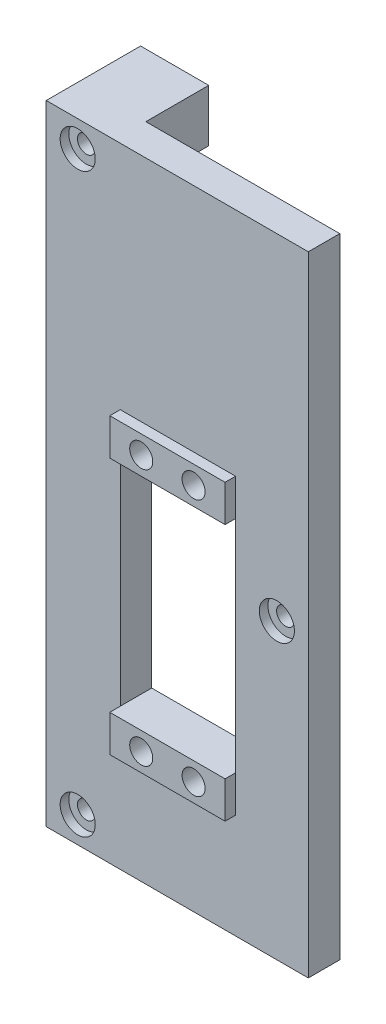
ISO-10303-21;
HEADER;
FILE_DESCRIPTION(('STEP AP214'),'2;1');
FILE_NAME('part.step','',(''),(''),'','','');
FILE_SCHEMA(('AUTOMOTIVE_DESIGN { 1 0 10303 214 1 1 1 1 }'));
ENDSEC;
DATA;
#1=APPLICATION_CONTEXT('core data for automotive mechanical design processes');
#2=APPLICATION_PROTOCOL_DEFINITION('international standard','automotive_design',2000,#1);
#3=PRODUCT_CONTEXT('',#1,'mechanical');
#4=PRODUCT('Part','Part','',(#3));
#5=PRODUCT_RELATED_PRODUCT_CATEGORY('part','',(#4));
#6=PRODUCT_DEFINITION_FORMATION('','',#4);
#7=PRODUCT_DEFINITION_CONTEXT('part definition',#1,'design');
#8=PRODUCT_DEFINITION('design','',#6,#7);
#9=PRODUCT_DEFINITION_SHAPE('','',#8);
#10=(LENGTH_UNIT() NAMED_UNIT(*) SI_UNIT(.MILLI.,.METRE.));
#11=(NAMED_UNIT(*) PLANE_ANGLE_UNIT() SI_UNIT($,.RADIAN.));
#12=(NAMED_UNIT(*) SI_UNIT($,.STERADIAN.) SOLID_ANGLE_UNIT());
#13=UNCERTAINTY_MEASURE_WITH_UNIT(LENGTH_MEASURE(1.E-05),#10,'distance_accuracy_value','');
#14=(GEOMETRIC_REPRESENTATION_CONTEXT(3) GLOBAL_UNCERTAINTY_ASSIGNED_CONTEXT((#13)) GLOBAL_UNIT_ASSIGNED_CONTEXT((#10,
#11,#12)) REPRESENTATION_CONTEXT('',''));
#15=CARTESIAN_POINT('',(0.,0.,0.));
#16=DIRECTION('',(0.,0.,1.));
#17=DIRECTION('',(1.,0.,0.));
#18=AXIS2_PLACEMENT_3D('',#15,#16,#17);
#19=CARTESIAN_POINT('',(-25.,50.,-12.));
#20=DIRECTION('',(0.,1.,0.));
#21=DIRECTION('',(-1.,0.,0.));
#22=AXIS2_PLACEMENT_3D('',#19,#20,#21);
#23=PLANE('',#22);
#24=DIRECTION('',(0.,0.,-1.));
#25=VECTOR('',#24,1.);
#26=CARTESIAN_POINT('',(-12.,50.,0.));
#27=LINE('',#26,#25);
#28=CARTESIAN_POINT('',(-12.,50.,0.));
#29=VERTEX_POINT('',#28);
#30=CARTESIAN_POINT('',(-12.,50.,-12.));
#31=VERTEX_POINT('',#30);
#32=EDGE_CURVE('E311',#29,#31,#27,.T.);
#33=ORIENTED_EDGE('',*,*,#32,.F.);
#34=DIRECTION('',(-1.,0.,0.));
#35=VECTOR('',#34,1.);
#36=CARTESIAN_POINT('',(-25.,50.,0.));
#37=LINE('',#36,#35);
#38=CARTESIAN_POINT('',(-25.,50.,0.));
#39=VERTEX_POINT('',#38);
#40=EDGE_CURVE('E343',#29,#39,#37,.T.);
#41=ORIENTED_EDGE('',*,*,#40,.T.);
#42=DIRECTION('',(0.,0.,1.));
#43=VECTOR('',#42,1.);
#44=CARTESIAN_POINT('',(-25.,50.,-12.));
#45=LINE('',#44,#43);
#46=CARTESIAN_POINT('',(-25.,50.,-12.));
#47=VERTEX_POINT('',#46);
#48=EDGE_CURVE('E347',#47,#39,#45,.T.);
#49=ORIENTED_EDGE('',*,*,#48,.F.);
#50=DIRECTION('',(-1.,0.,0.));
#51=VECTOR('',#50,1.);
#52=CARTESIAN_POINT('',(-25.,50.,-12.));
#53=LINE('',#52,#51);
#54=EDGE_CURVE('E355',#31,#47,#53,.T.);
#55=ORIENTED_EDGE('',*,*,#54,.F.);
#56=EDGE_LOOP('',(#33,#41,#49,#55));
#57=FACE_BOUND('',#56,.T.);
#58=ADVANCED_FACE('F45',(#57),#23,.F.);
#59=CARTESIAN_POINT('',(0.,0.,-12.));
#60=DIRECTION('',(0.,0.,-1.));
#61=DIRECTION('',(-1.,0.,0.));
#62=AXIS2_PLACEMENT_3D('',#59,#60,#61);
#63=PLANE('',#62);
#64=CARTESIAN_POINT('',(-19.,55.,-12.));
#65=DIRECTION('',(0.,0.,-1.));
#66=DIRECTION('',(-1.,0.,0.));
#67=AXIS2_PLACEMENT_3D('',#64,#65,#66);
#68=CIRCLE('',#67,1.7);
#69=CARTESIAN_POINT('',(-20.7,55.,-12.));
#70=VERTEX_POINT('',#69);
#71=EDGE_CURVE('E49',#70,#70,#68,.T.);
#72=ORIENTED_EDGE('',*,*,#71,.F.);
#73=EDGE_LOOP('',(#72));
#74=FACE_BOUND('',#73,.T.);
#75=DIRECTION('',(1.,0.,0.));
#76=VECTOR('',#75,1.);
#77=CARTESIAN_POINT('',(-25.,60.,-12.));
#78=LINE('',#77,#76);
#79=CARTESIAN_POINT('',(-25.,60.,-12.));
#80=VERTEX_POINT('',#79);
#81=CARTESIAN_POINT('',(-12.,60.,-12.));
#82=VERTEX_POINT('',#81);
#83=EDGE_CURVE('E352',#80,#82,#78,.T.);
#84=ORIENTED_EDGE('',*,*,#83,.T.);
#85=DIRECTION('',(0.,1.,0.));
#86=VECTOR('',#85,1.);
#87=CARTESIAN_POINT('',(-12.,50.,-12.));
#88=LINE('',#87,#86);
#89=EDGE_CURVE('E328',#31,#82,#88,.T.);
#90=ORIENTED_EDGE('',*,*,#89,.F.);
#91=ORIENTED_EDGE('',*,*,#54,.T.);
#92=DIRECTION('',(0.,1.,0.));
#93=VECTOR('',#92,1.);
#94=CARTESIAN_POINT('',(-25.,60.,-12.));
#95=LINE('',#94,#93);
#96=EDGE_CURVE('E350',#47,#80,#95,.T.);
#97=ORIENTED_EDGE('',*,*,#96,.T.);
#98=EDGE_LOOP('',(#84,#90,#91,#97));
#99=FACE_BOUND('',#98,.T.);
#100=ADVANCED_FACE('F387',(#74,#99),#63,.T.);
#101=CARTESIAN_POINT('',(0.,0.,0.));
#102=DIRECTION('',(0.,0.,1.));
#103=DIRECTION('',(1.,0.,0.));
#104=AXIS2_PLACEMENT_3D('',#101,#102,#103);
#105=PLANE('',#104);
#106=CARTESIAN_POINT('',(5.12000000000001,-36.53,0.));
#107=DIRECTION('',(0.,0.,1.));
#108=DIRECTION('',(1.,0.,0.));
#109=AXIS2_PLACEMENT_3D('',#106,#107,#108);
#110=CIRCLE('',#109,2.2);
#111=CARTESIAN_POINT('',(7.32000000000001,-36.53,0.));
#112=VERTEX_POINT('',#111);
#113=EDGE_CURVE('E825',#112,#112,#110,.T.);
#114=ORIENTED_EDGE('',*,*,#113,.T.);
#115=EDGE_LOOP('',(#114));
#116=FACE_BOUND('',#115,.T.);
#117=CARTESIAN_POINT('',(-4.87999999999999,12.47,0.));
#118=DIRECTION('',(0.,0.,1.));
#119=DIRECTION('',(1.,0.,0.));
#120=AXIS2_PLACEMENT_3D('',#117,#118,#119);
#121=CIRCLE('',#120,2.2);
#122=CARTESIAN_POINT('',(-2.67999999999999,12.47,0.));
#123=VERTEX_POINT('',#122);
#124=EDGE_CURVE('E826',#123,#123,#121,.T.);
#125=ORIENTED_EDGE('',*,*,#124,.T.);
#126=EDGE_LOOP('',(#125));
#127=FACE_BOUND('',#126,.T.);
#128=CARTESIAN_POINT('',(5.12000000000001,12.47,0.));
#129=DIRECTION('',(0.,0.,1.));
#130=DIRECTION('',(1.,0.,0.));
#131=AXIS2_PLACEMENT_3D('',#128,#129,#130);
#132=CIRCLE('',#131,2.2);
#133=CARTESIAN_POINT('',(7.32000000000001,12.47,0.));
#134=VERTEX_POINT('',#133);
#135=EDGE_CURVE('E831',#134,#134,#132,.T.);
#136=ORIENTED_EDGE('',*,*,#135,.T.);
#137=EDGE_LOOP('',(#136));
#138=FACE_BOUND('',#137,.T.);
#139=CARTESIAN_POINT('',(-4.87999999999999,-36.53,0.));
#140=DIRECTION('',(0.,0.,1.));
#141=DIRECTION('',(1.,0.,0.));
#142=AXIS2_PLACEMENT_3D('',#139,#140,#141);
#143=CIRCLE('',#142,2.2);
#144=CARTESIAN_POINT('',(-2.67999999999999,-36.53,0.));
#145=VERTEX_POINT('',#144);
#146=EDGE_CURVE('E221',#145,#145,#143,.T.);
#147=ORIENTED_EDGE('',*,*,#146,.T.);
#148=EDGE_LOOP('',(#147));
#149=FACE_BOUND('',#148,.T.);
#150=DIRECTION('',(-1.,0.,0.));
#151=VECTOR('',#150,1.);
#152=CARTESIAN_POINT('',(0.,8.97000000000001,0.));
#153=LINE('',#152,#151);
#154=CARTESIAN_POINT('',(11.12,8.97000000000001,0.));
#155=VERTEX_POINT('',#154);
#156=CARTESIAN_POINT('',(-10.88,8.97000000000001,0.));
#157=VERTEX_POINT('',#156);
#158=EDGE_CURVE('E270',#155,#157,#153,.T.);
#159=ORIENTED_EDGE('',*,*,#158,.T.);
#160=DIRECTION('',(0.,-1.,0.));
#161=VECTOR('',#160,1.);
#162=CARTESIAN_POINT('',(-10.88,0.,0.));
#163=LINE('',#162,#161);
#164=CARTESIAN_POINT('',(-10.88,-33.03,0.));
#165=VERTEX_POINT('',#164);
#166=EDGE_CURVE('E273',#157,#165,#163,.T.);
#167=ORIENTED_EDGE('',*,*,#166,.T.);
#168=DIRECTION('',(1.,0.,0.));
#169=VECTOR('',#168,1.);
#170=CARTESIAN_POINT('',(0.,-33.03,0.));
#171=LINE('',#170,#169);
#172=CARTESIAN_POINT('',(11.12,-33.03,0.));
#173=VERTEX_POINT('',#172);
#174=EDGE_CURVE('E257',#165,#173,#171,.T.);
#175=ORIENTED_EDGE('',*,*,#174,.T.);
#176=DIRECTION('',(0.,1.,0.));
#177=VECTOR('',#176,1.);
#178=CARTESIAN_POINT('',(11.12,0.,0.));
#179=LINE('',#178,#177);
#180=EDGE_CURVE('E267',#173,#155,#179,.T.);
#181=ORIENTED_EDGE('',*,*,#180,.T.);
#182=EDGE_LOOP('',(#159,#167,#175,#181));
#183=FACE_BOUND('',#182,.T.);
#184=CARTESIAN_POINT('',(19.,-3.99999999999999,0.));
#185=DIRECTION('',(0.,0.,-1.));
#186=DIRECTION('',(-1.,0.,0.));
#187=AXIS2_PLACEMENT_3D('',#184,#185,#186);
#188=CIRCLE('',#187,1.7);
#189=CARTESIAN_POINT('',(17.3,-3.99999999999999,0.));
#190=VERTEX_POINT('',#189);
#191=EDGE_CURVE('E285',#190,#190,#188,.T.);
#192=ORIENTED_EDGE('',*,*,#191,.F.);
#193=EDGE_LOOP('',(#192));
#194=FACE_BOUND('',#193,.T.);
#195=DIRECTION('',(1.,0.,0.));
#196=VECTOR('',#195,1.);
#197=CARTESIAN_POINT('',(-25.,-50.,0.));
#198=LINE('',#197,#196);
#199=CARTESIAN_POINT('',(-25.,-50.,0.));
#200=VERTEX_POINT('',#199);
#201=CARTESIAN_POINT('',(-12.,-50.,0.));
#202=VERTEX_POINT('',#201);
#203=EDGE_CURVE('E335',#200,#202,#198,.T.);
#204=ORIENTED_EDGE('',*,*,#203,.F.);
#205=DIRECTION('',(0.,-1.,0.));
#206=VECTOR('',#205,1.);
#207=CARTESIAN_POINT('',(-25.,60.,0.));
#208=LINE('',#207,#206);
#209=EDGE_CURVE('E363',#39,#200,#208,.T.);
#210=ORIENTED_EDGE('',*,*,#209,.F.);
#211=ORIENTED_EDGE('',*,*,#40,.F.);
#212=DIRECTION('',(0.,-1.,0.));
#213=VECTOR('',#212,1.);
#214=CARTESIAN_POINT('',(-12.,50.,0.));
#215=LINE('',#214,#213);
#216=CARTESIAN_POINT('',(-12.,60.,0.));
#217=VERTEX_POINT('',#216);
#218=EDGE_CURVE('E324',#217,#29,#215,.T.);
#219=ORIENTED_EDGE('',*,*,#218,.F.);
#220=DIRECTION('',(1.,0.,0.));
#221=VECTOR('',#220,1.);
#222=CARTESIAN_POINT('',(-12.,60.,0.));
#223=LINE('',#222,#221);
#224=CARTESIAN_POINT('',(25.,60.,0.));
#225=VERTEX_POINT('',#224);
#226=EDGE_CURVE('E306',#217,#225,#223,.T.);
#227=ORIENTED_EDGE('',*,*,#226,.T.);
#228=DIRECTION('',(0.,1.,0.));
#229=VECTOR('',#228,1.);
#230=CARTESIAN_POINT('',(25.,60.,0.));
#231=LINE('',#230,#229);
#232=CARTESIAN_POINT('',(25.,-60.,0.));
#233=VERTEX_POINT('',#232);
#234=EDGE_CURVE('E346',#233,#225,#231,.T.);
#235=ORIENTED_EDGE('',*,*,#234,.F.);
#236=DIRECTION('',(1.,0.,0.));
#237=VECTOR('',#236,1.);
#238=CARTESIAN_POINT('',(-12.,-60.,0.));
#239=LINE('',#238,#237);
#240=CARTESIAN_POINT('',(-12.,-60.,0.));
#241=VERTEX_POINT('',#240);
#242=EDGE_CURVE('E318',#241,#233,#239,.T.);
#243=ORIENTED_EDGE('',*,*,#242,.F.);
#244=DIRECTION('',(0.,-1.,0.));
#245=VECTOR('',#244,1.);
#246=CARTESIAN_POINT('',(-12.,-50.,0.));
#247=LINE('',#246,#245);
#248=EDGE_CURVE('E310',#202,#241,#247,.T.);
#249=ORIENTED_EDGE('',*,*,#248,.F.);
#250=EDGE_LOOP('',(#204,#210,#211,#219,#227,#235,#243,#249));
#251=FACE_BOUND('',#250,.T.);
#252=ADVANCED_FACE('F390',(#116,#127,#138,#149,#183,#194,#251),#105,.F.);
#253=CARTESIAN_POINT('',(25.,-60.,6.));
#254=DIRECTION('',(0.,1.,0.));
#255=DIRECTION('',(0.,0.,1.));
#256=AXIS2_PLACEMENT_3D('',#253,#254,#255);
#257=PLANE('',#256);
#258=DIRECTION('',(0.,0.,-1.));
#259=VECTOR('',#258,1.);
#260=CARTESIAN_POINT('',(-12.,-60.,0.));
#261=LINE('',#260,#259);
#262=CARTESIAN_POINT('',(-12.,-60.,-12.));
#263=VERTEX_POINT('',#262);
#264=EDGE_CURVE('E314',#241,#263,#261,.T.);
#265=ORIENTED_EDGE('',*,*,#264,.F.);
#266=ORIENTED_EDGE('',*,*,#242,.T.);
#267=DIRECTION('',(0.,0.,-1.));
#268=VECTOR('',#267,1.);
#269=CARTESIAN_POINT('',(25.,-60.,6.));
#270=LINE('',#269,#268);
#271=CARTESIAN_POINT('',(25.,-60.,6.));
#272=VERTEX_POINT('',#271);
#273=EDGE_CURVE('E11',#272,#233,#270,.T.);
#274=ORIENTED_EDGE('',*,*,#273,.F.);
#275=DIRECTION('',(1.,0.,0.));
#276=VECTOR('',#275,1.);
#277=CARTESIAN_POINT('',(25.,-60.,6.));
#278=LINE('',#277,#276);
#279=CARTESIAN_POINT('',(-25.,-60.,6.));
#280=VERTEX_POINT('',#279);
#281=EDGE_CURVE('E359',#280,#272,#278,.T.);
#282=ORIENTED_EDGE('',*,*,#281,.F.);
#283=DIRECTION('',(0.,0.,-1.));
#284=VECTOR('',#283,1.);
#285=CARTESIAN_POINT('',(-25.,-60.,6.));
#286=LINE('',#285,#284);
#287=CARTESIAN_POINT('',(-25.,-60.,-12.));
#288=VERTEX_POINT('',#287);
#289=EDGE_CURVE('E369',#280,#288,#286,.T.);
#290=ORIENTED_EDGE('',*,*,#289,.T.);
#291=DIRECTION('',(-1.,0.,0.));
#292=VECTOR('',#291,1.);
#293=CARTESIAN_POINT('',(-25.,-60.,-12.));
#294=LINE('',#293,#292);
#295=EDGE_CURVE('E338',#263,#288,#294,.T.);
#296=ORIENTED_EDGE('',*,*,#295,.F.);
#297=EDGE_LOOP('',(#265,#266,#274,#282,#290,#296));
#298=FACE_BOUND('',#297,.T.);
#299=ADVANCED_FACE('F47',(#298),#257,.F.);
#300=CARTESIAN_POINT('',(25.,60.,6.));
#301=DIRECTION('',(-1.,0.,0.));
#302=DIRECTION('',(0.,-1.,0.));
#303=AXIS2_PLACEMENT_3D('',#300,#301,#302);
#304=PLANE('',#303);
#305=ORIENTED_EDGE('',*,*,#273,.T.);
#306=ORIENTED_EDGE('',*,*,#234,.T.);
#307=DIRECTION('',(0.,0.,-1.));
#308=VECTOR('',#307,1.);
#309=CARTESIAN_POINT('',(25.,60.,6.));
#310=LINE('',#309,#308);
#311=CARTESIAN_POINT('',(25.,60.,6.));
#312=VERTEX_POINT('',#311);
#313=EDGE_CURVE('E54',#312,#225,#310,.T.);
#314=ORIENTED_EDGE('',*,*,#313,.F.);
#315=DIRECTION('',(0.,1.,0.));
#316=VECTOR('',#315,1.);
#317=CARTESIAN_POINT('',(25.,60.,6.));
#318=LINE('',#317,#316);
#319=EDGE_CURVE('E362',#272,#312,#318,.T.);
#320=ORIENTED_EDGE('',*,*,#319,.F.);
#321=EDGE_LOOP('',(#305,#306,#314,#320));
#322=FACE_BOUND('',#321,.T.);
#323=ADVANCED_FACE('F422',(#322),#304,.F.);
#324=CARTESIAN_POINT('',(25.,60.,6.));
#325=DIRECTION('',(0.,-1.,0.));
#326=DIRECTION('',(0.,0.,-1.));
#327=AXIS2_PLACEMENT_3D('',#324,#325,#326);
#328=PLANE('',#327);
#329=ORIENTED_EDGE('',*,*,#313,.T.);
#330=ORIENTED_EDGE('',*,*,#226,.F.);
#331=DIRECTION('',(0.,0.,1.));
#332=VECTOR('',#331,1.);
#333=CARTESIAN_POINT('',(-12.,60.,0.));
#334=LINE('',#333,#332);
#335=EDGE_CURVE('E326',#82,#217,#334,.T.);
#336=ORIENTED_EDGE('',*,*,#335,.F.);
#337=ORIENTED_EDGE('',*,*,#83,.F.);
#338=DIRECTION('',(0.,0.,-1.));
#339=VECTOR('',#338,1.);
#340=CARTESIAN_POINT('',(-25.,60.,6.));
#341=LINE('',#340,#339);
#342=CARTESIAN_POINT('',(-25.,60.,6.));
#343=VERTEX_POINT('',#342);
#344=EDGE_CURVE('E375',#343,#80,#341,.T.);
#345=ORIENTED_EDGE('',*,*,#344,.F.);
#346=DIRECTION('',(-1.,0.,0.));
#347=VECTOR('',#346,1.);
#348=CARTESIAN_POINT('',(25.,60.,6.));
#349=LINE('',#348,#347);
#350=EDGE_CURVE('E365',#312,#343,#349,.T.);
#351=ORIENTED_EDGE('',*,*,#350,.F.);
#352=EDGE_LOOP('',(#329,#330,#336,#337,#345,#351));
#353=FACE_BOUND('',#352,.T.);
#354=ADVANCED_FACE('F399',(#353),#328,.F.);
#355=CARTESIAN_POINT('',(-25.,60.,6.));
#356=DIRECTION('',(1.,0.,0.));
#357=DIRECTION('',(0.,1.,0.));
#358=AXIS2_PLACEMENT_3D('',#355,#356,#357);
#359=PLANE('',#358);
#360=ORIENTED_EDGE('',*,*,#344,.T.);
#361=ORIENTED_EDGE('',*,*,#96,.F.);
#362=ORIENTED_EDGE('',*,*,#48,.T.);
#363=ORIENTED_EDGE('',*,*,#209,.T.);
#364=DIRECTION('',(0.,0.,1.));
#365=VECTOR('',#364,1.);
#366=CARTESIAN_POINT('',(-25.,-50.,-12.));
#367=LINE('',#366,#365);
#368=CARTESIAN_POINT('',(-25.,-50.,-12.));
#369=VERTEX_POINT('',#368);
#370=EDGE_CURVE('E340',#369,#200,#367,.T.);
#371=ORIENTED_EDGE('',*,*,#370,.F.);
#372=DIRECTION('',(0.,1.,0.));
#373=VECTOR('',#372,1.);
#374=CARTESIAN_POINT('',(-25.,-60.,-12.));
#375=LINE('',#374,#373);
#376=EDGE_CURVE('E331',#288,#369,#375,.T.);
#377=ORIENTED_EDGE('',*,*,#376,.F.);
#378=ORIENTED_EDGE('',*,*,#289,.F.);
#379=DIRECTION('',(0.,-1.,0.));
#380=VECTOR('',#379,1.);
#381=CARTESIAN_POINT('',(-25.,60.,6.));
#382=LINE('',#381,#380);
#383=EDGE_CURVE('E367',#343,#280,#382,.T.);
#384=ORIENTED_EDGE('',*,*,#383,.F.);
#385=EDGE_LOOP('',(#360,#361,#362,#363,#371,#377,#378,#384));
#386=FACE_BOUND('',#385,.T.);
#387=ADVANCED_FACE('F413',(#386),#359,.F.);
#388=CARTESIAN_POINT('',(0.,0.,6.));
#389=DIRECTION('',(0.,0.,1.));
#390=DIRECTION('',(1.,0.,0.));
#391=AXIS2_PLACEMENT_3D('',#388,#389,#390);
#392=PLANE('',#391);
#393=DIRECTION('',(0.,-1.,0.));
#394=VECTOR('',#393,1.);
#395=CARTESIAN_POINT('',(-10.88,-33.03,6.));
#396=LINE('',#395,#394);
#397=CARTESIAN_POINT('',(-10.88,-33.03,6.));
#398=VERTEX_POINT('',#397);
#399=CARTESIAN_POINT('',(-10.88,-40.03,6.));
#400=VERTEX_POINT('',#399);
#401=EDGE_CURVE('E207',#398,#400,#396,.T.);
#402=ORIENTED_EDGE('',*,*,#401,.F.);
#403=DIRECTION('',(0.,-1.,0.));
#404=VECTOR('',#403,1.);
#405=CARTESIAN_POINT('',(-10.88,8.97000000000001,6.));
#406=LINE('',#405,#404);
#407=CARTESIAN_POINT('',(-10.88,8.97000000000001,6.));
#408=VERTEX_POINT('',#407);
#409=EDGE_CURVE('E208',#408,#398,#406,.T.);
#410=ORIENTED_EDGE('',*,*,#409,.F.);
#411=DIRECTION('',(0.,-1.,0.));
#412=VECTOR('',#411,1.);
#413=CARTESIAN_POINT('',(-10.88,8.97000000000001,6.));
#414=LINE('',#413,#412);
#415=CARTESIAN_POINT('',(-10.88,15.97,6.));
#416=VERTEX_POINT('',#415);
#417=EDGE_CURVE('E69',#416,#408,#414,.T.);
#418=ORIENTED_EDGE('',*,*,#417,.F.);
#419=DIRECTION('',(-1.,0.,0.));
#420=VECTOR('',#419,1.);
#421=CARTESIAN_POINT('',(-10.88,15.97,6.));
#422=LINE('',#421,#420);
#423=CARTESIAN_POINT('',(11.12,15.97,6.));
#424=VERTEX_POINT('',#423);
#425=EDGE_CURVE('E232',#424,#416,#422,.T.);
#426=ORIENTED_EDGE('',*,*,#425,.F.);
#427=DIRECTION('',(0.,1.,0.));
#428=VECTOR('',#427,1.);
#429=CARTESIAN_POINT('',(11.12,8.97000000000001,6.));
#430=LINE('',#429,#428);
#431=CARTESIAN_POINT('',(11.12,8.97000000000001,6.));
#432=VERTEX_POINT('',#431);
#433=EDGE_CURVE('E235',#432,#424,#430,.T.);
#434=ORIENTED_EDGE('',*,*,#433,.F.);
#435=DIRECTION('',(0.,1.,0.));
#436=VECTOR('',#435,1.);
#437=CARTESIAN_POINT('',(11.12,8.97000000000001,6.));
#438=LINE('',#437,#436);
#439=CARTESIAN_POINT('',(11.12,-33.03,6.));
#440=VERTEX_POINT('',#439);
#441=EDGE_CURVE('E211',#440,#432,#438,.T.);
#442=ORIENTED_EDGE('',*,*,#441,.F.);
#443=DIRECTION('',(0.,1.,0.));
#444=VECTOR('',#443,1.);
#445=CARTESIAN_POINT('',(11.12,-33.03,6.));
#446=LINE('',#445,#444);
#447=CARTESIAN_POINT('',(11.12,-40.03,6.));
#448=VERTEX_POINT('',#447);
#449=EDGE_CURVE('E204',#448,#440,#446,.T.);
#450=ORIENTED_EDGE('',*,*,#449,.F.);
#451=DIRECTION('',(1.,0.,0.));
#452=VECTOR('',#451,1.);
#453=CARTESIAN_POINT('',(-10.88,-40.03,6.));
#454=LINE('',#453,#452);
#455=EDGE_CURVE('E62',#400,#448,#454,.T.);
#456=ORIENTED_EDGE('',*,*,#455,.F.);
#457=EDGE_LOOP('',(#402,#410,#418,#426,#434,#442,#450,#456));
#458=FACE_BOUND('',#457,.T.);
#459=CARTESIAN_POINT('',(19.,-3.99999999999999,6.));
#460=DIRECTION('',(0.,0.,1.));
#461=DIRECTION('',(1.,0.,0.));
#462=AXIS2_PLACEMENT_3D('',#459,#460,#461);
#463=CIRCLE('',#462,3.35);
#464=CARTESIAN_POINT('',(22.35,-3.99999999999999,6.));
#465=VERTEX_POINT('',#464);
#466=EDGE_CURVE('E276',#465,#465,#463,.T.);
#467=ORIENTED_EDGE('',*,*,#466,.F.);
#468=EDGE_LOOP('',(#467));
#469=FACE_BOUND('',#468,.T.);
#470=CARTESIAN_POINT('',(-19.,55.,6.));
#471=DIRECTION('',(0.,0.,1.));
#472=DIRECTION('',(1.,0.,0.));
#473=AXIS2_PLACEMENT_3D('',#470,#471,#472);
#474=CIRCLE('',#473,3.35);
#475=CARTESIAN_POINT('',(-15.65,55.,6.));
#476=VERTEX_POINT('',#475);
#477=EDGE_CURVE('E288',#476,#476,#474,.T.);
#478=ORIENTED_EDGE('',*,*,#477,.F.);
#479=EDGE_LOOP('',(#478));
#480=FACE_BOUND('',#479,.T.);
#481=CARTESIAN_POINT('',(-19.,-55.,6.));
#482=DIRECTION('',(0.,0.,1.));
#483=DIRECTION('',(1.,0.,0.));
#484=AXIS2_PLACEMENT_3D('',#481,#482,#483);
#485=CIRCLE('',#484,3.35);
#486=CARTESIAN_POINT('',(-15.65,-55.,6.));
#487=VERTEX_POINT('',#486);
#488=EDGE_CURVE('E297',#487,#487,#485,.T.);
#489=ORIENTED_EDGE('',*,*,#488,.F.);
#490=EDGE_LOOP('',(#489));
#491=FACE_BOUND('',#490,.T.);
#492=ORIENTED_EDGE('',*,*,#281,.T.);
#493=ORIENTED_EDGE('',*,*,#319,.T.);
#494=ORIENTED_EDGE('',*,*,#350,.T.);
#495=ORIENTED_EDGE('',*,*,#383,.T.);
#496=EDGE_LOOP('',(#492,#493,#494,#495));
#497=FACE_BOUND('',#496,.T.);
#498=ADVANCED_FACE('F418',(#458,#469,#480,#491,#497),#392,.T.);
#499=CARTESIAN_POINT('',(-25.,-50.,-12.));
#500=DIRECTION('',(0.,-1.,0.));
#501=DIRECTION('',(0.,0.,-1.));
#502=AXIS2_PLACEMENT_3D('',#499,#500,#501);
#503=PLANE('',#502);
#504=ORIENTED_EDGE('',*,*,#203,.T.);
#505=DIRECTION('',(0.,0.,1.));
#506=VECTOR('',#505,1.);
#507=CARTESIAN_POINT('',(-12.,-50.,0.));
#508=LINE('',#507,#506);
#509=CARTESIAN_POINT('',(-12.,-50.,-12.));
#510=VERTEX_POINT('',#509);
#511=EDGE_CURVE('E307',#510,#202,#508,.T.);
#512=ORIENTED_EDGE('',*,*,#511,.F.);
#513=DIRECTION('',(1.,0.,0.));
#514=VECTOR('',#513,1.);
#515=CARTESIAN_POINT('',(-25.,-50.,-12.));
#516=LINE('',#515,#514);
#517=EDGE_CURVE('E334',#369,#510,#516,.T.);
#518=ORIENTED_EDGE('',*,*,#517,.F.);
#519=ORIENTED_EDGE('',*,*,#370,.T.);
#520=EDGE_LOOP('',(#504,#512,#518,#519));
#521=FACE_BOUND('',#520,.T.);
#522=ADVANCED_FACE('F435',(#521),#503,.F.);
#523=CARTESIAN_POINT('',(0.,0.,-12.));
#524=DIRECTION('',(0.,0.,-1.));
#525=DIRECTION('',(-1.,0.,0.));
#526=AXIS2_PLACEMENT_3D('',#523,#524,#525);
#527=PLANE('',#526);
#528=DIRECTION('',(0.,1.,0.));
#529=VECTOR('',#528,1.);
#530=CARTESIAN_POINT('',(-12.,-50.,-12.));
#531=LINE('',#530,#529);
#532=EDGE_CURVE('E316',#263,#510,#531,.T.);
#533=ORIENTED_EDGE('',*,*,#532,.F.);
#534=ORIENTED_EDGE('',*,*,#295,.T.);
#535=ORIENTED_EDGE('',*,*,#376,.T.);
#536=ORIENTED_EDGE('',*,*,#517,.T.);
#537=EDGE_LOOP('',(#533,#534,#535,#536));
#538=FACE_BOUND('',#537,.T.);
#539=CARTESIAN_POINT('',(-19.,-55.,-12.));
#540=DIRECTION('',(0.,0.,-1.));
#541=DIRECTION('',(-1.,0.,0.));
#542=AXIS2_PLACEMENT_3D('',#539,#540,#541);
#543=CIRCLE('',#542,1.7);
#544=CARTESIAN_POINT('',(-20.7,-55.,-12.));
#545=VERTEX_POINT('',#544);
#546=EDGE_CURVE('E321',#545,#545,#543,.T.);
#547=ORIENTED_EDGE('',*,*,#546,.F.);
#548=EDGE_LOOP('',(#547));
#549=FACE_BOUND('',#548,.T.);
#550=ADVANCED_FACE('F431',(#538,#549),#527,.T.);
#551=CARTESIAN_POINT('',(-19.,-55.,-13.));
#552=DIRECTION('',(0.,0.,1.));
#553=DIRECTION('',(1.,0.,0.));
#554=AXIS2_PLACEMENT_3D('',#551,#552,#553);
#555=CYLINDRICAL_SURFACE('',#554,1.7);
#556=ORIENTED_EDGE('',*,*,#546,.T.);
#557=EDGE_LOOP('',(#556));
#558=FACE_BOUND('',#557,.T.);
#559=CARTESIAN_POINT('',(-19.,-55.,4.35));
#560=DIRECTION('',(0.,0.,1.));
#561=DIRECTION('',(1.,0.,0.));
#562=AXIS2_PLACEMENT_3D('',#559,#560,#561);
#563=CIRCLE('',#562,1.7);
#564=CARTESIAN_POINT('',(-17.3,-55.,4.35));
#565=VERTEX_POINT('',#564);
#566=EDGE_CURVE('E303',#565,#565,#563,.T.);
#567=ORIENTED_EDGE('',*,*,#566,.T.);
#568=EDGE_LOOP('',(#567));
#569=FACE_BOUND('',#568,.T.);
#570=ADVANCED_FACE('F442',(#558,#569),#555,.F.);
#571=CARTESIAN_POINT('',(-19.,55.,-13.));
#572=DIRECTION('',(0.,0.,1.));
#573=DIRECTION('',(1.,0.,0.));
#574=AXIS2_PLACEMENT_3D('',#571,#572,#573);
#575=CYLINDRICAL_SURFACE('',#574,1.7);
#576=ORIENTED_EDGE('',*,*,#71,.T.);
#577=EDGE_LOOP('',(#576));
#578=FACE_BOUND('',#577,.T.);
#579=CARTESIAN_POINT('',(-19.,55.,4.35));
#580=DIRECTION('',(0.,0.,1.));
#581=DIRECTION('',(1.,0.,0.));
#582=AXIS2_PLACEMENT_3D('',#579,#580,#581);
#583=CIRCLE('',#582,1.7);
#584=CARTESIAN_POINT('',(-17.3,55.,4.35));
#585=VERTEX_POINT('',#584);
#586=EDGE_CURVE('E294',#585,#585,#583,.T.);
#587=ORIENTED_EDGE('',*,*,#586,.T.);
#588=EDGE_LOOP('',(#587));
#589=FACE_BOUND('',#588,.T.);
#590=ADVANCED_FACE('F384',(#578,#589),#575,.F.);
#591=CARTESIAN_POINT('',(-12.,0.,0.));
#592=DIRECTION('',(-1.,0.,0.));
#593=DIRECTION('',(0.,0.,1.));
#594=AXIS2_PLACEMENT_3D('',#591,#592,#593);
#595=PLANE('',#594);
#596=ORIENTED_EDGE('',*,*,#511,.T.);
#597=ORIENTED_EDGE('',*,*,#248,.T.);
#598=ORIENTED_EDGE('',*,*,#264,.T.);
#599=ORIENTED_EDGE('',*,*,#532,.T.);
#600=EDGE_LOOP('',(#596,#597,#598,#599));
#601=FACE_BOUND('',#600,.T.);
#602=ADVANCED_FACE('F428',(#601),#595,.F.);
#603=CARTESIAN_POINT('',(-12.,0.,0.));
#604=DIRECTION('',(1.,0.,0.));
#605=DIRECTION('',(0.,0.,-1.));
#606=AXIS2_PLACEMENT_3D('',#603,#604,#605);
#607=PLANE('',#606);
#608=ORIENTED_EDGE('',*,*,#32,.T.);
#609=ORIENTED_EDGE('',*,*,#89,.T.);
#610=ORIENTED_EDGE('',*,*,#335,.T.);
#611=ORIENTED_EDGE('',*,*,#218,.T.);
#612=EDGE_LOOP('',(#608,#609,#610,#611));
#613=FACE_BOUND('',#612,.T.);
#614=ADVANCED_FACE('F405',(#613),#607,.T.);
#615=CARTESIAN_POINT('',(-17.3,-55.,4.35));
#616=DIRECTION('',(0.,0.,-1.));
#617=DIRECTION('',(-1.,0.,0.));
#618=AXIS2_PLACEMENT_3D('',#615,#616,#617);
#619=PLANE('',#618);
#620=ORIENTED_EDGE('',*,*,#566,.F.);
#621=EDGE_LOOP('',(#620));
#622=FACE_BOUND('',#621,.T.);
#623=CARTESIAN_POINT('',(-19.,-55.,4.35));
#624=DIRECTION('',(0.,0.,1.));
#625=DIRECTION('',(1.,0.,0.));
#626=AXIS2_PLACEMENT_3D('',#623,#624,#625);
#627=CIRCLE('',#626,3.35);
#628=CARTESIAN_POINT('',(-15.65,-55.,4.35));
#629=VERTEX_POINT('',#628);
#630=EDGE_CURVE('E300',#629,#629,#627,.T.);
#631=ORIENTED_EDGE('',*,*,#630,.T.);
#632=EDGE_LOOP('',(#631));
#633=FACE_BOUND('',#632,.T.);
#634=ADVANCED_FACE('F495',(#622,#633),#619,.F.);
#635=CARTESIAN_POINT('',(-19.,-55.,6.));
#636=DIRECTION('',(0.,0.,1.));
#637=DIRECTION('',(1.,0.,0.));
#638=AXIS2_PLACEMENT_3D('',#635,#636,#637);
#639=CYLINDRICAL_SURFACE('',#638,3.35);
#640=ORIENTED_EDGE('',*,*,#630,.F.);
#641=EDGE_LOOP('',(#640));
#642=FACE_BOUND('',#641,.T.);
#643=ORIENTED_EDGE('',*,*,#488,.T.);
#644=EDGE_LOOP('',(#643));
#645=FACE_BOUND('',#644,.T.);
#646=ADVANCED_FACE('F503',(#642,#645),#639,.F.);
#647=CARTESIAN_POINT('',(-17.3,55.,4.35));
#648=DIRECTION('',(0.,0.,-1.));
#649=DIRECTION('',(-1.,0.,0.));
#650=AXIS2_PLACEMENT_3D('',#647,#648,#649);
#651=PLANE('',#650);
#652=ORIENTED_EDGE('',*,*,#586,.F.);
#653=EDGE_LOOP('',(#652));
#654=FACE_BOUND('',#653,.T.);
#655=CARTESIAN_POINT('',(-19.,55.,4.35));
#656=DIRECTION('',(0.,0.,1.));
#657=DIRECTION('',(1.,0.,0.));
#658=AXIS2_PLACEMENT_3D('',#655,#656,#657);
#659=CIRCLE('',#658,3.35);
#660=CARTESIAN_POINT('',(-15.65,55.,4.35));
#661=VERTEX_POINT('',#660);
#662=EDGE_CURVE('E291',#661,#661,#659,.T.);
#663=ORIENTED_EDGE('',*,*,#662,.T.);
#664=EDGE_LOOP('',(#663));
#665=FACE_BOUND('',#664,.T.);
#666=ADVANCED_FACE('F512',(#654,#665),#651,.F.);
#667=CARTESIAN_POINT('',(-19.,55.,6.));
#668=DIRECTION('',(0.,0.,1.));
#669=DIRECTION('',(1.,0.,0.));
#670=AXIS2_PLACEMENT_3D('',#667,#668,#669);
#671=CYLINDRICAL_SURFACE('',#670,3.35);
#672=ORIENTED_EDGE('',*,*,#662,.F.);
#673=EDGE_LOOP('',(#672));
#674=FACE_BOUND('',#673,.T.);
#675=ORIENTED_EDGE('',*,*,#477,.T.);
#676=EDGE_LOOP('',(#675));
#677=FACE_BOUND('',#676,.T.);
#678=ADVANCED_FACE('F521',(#674,#677),#671,.F.);
#679=CARTESIAN_POINT('',(19.,-3.99999999999999,6.));
#680=DIRECTION('',(0.,0.,-1.));
#681=DIRECTION('',(-1.,0.,0.));
#682=AXIS2_PLACEMENT_3D('',#679,#680,#681);
#683=CYLINDRICAL_SURFACE('',#682,1.7);
#684=ORIENTED_EDGE('',*,*,#191,.T.);
#685=EDGE_LOOP('',(#684));
#686=FACE_BOUND('',#685,.T.);
#687=CARTESIAN_POINT('',(19.,-3.99999999999999,4.35));
#688=DIRECTION('',(0.,0.,1.));
#689=DIRECTION('',(1.,0.,0.));
#690=AXIS2_PLACEMENT_3D('',#687,#688,#689);
#691=CIRCLE('',#690,1.7);
#692=CARTESIAN_POINT('',(20.7,-3.99999999999999,4.35));
#693=VERTEX_POINT('',#692);
#694=EDGE_CURVE('E282',#693,#693,#691,.T.);
#695=ORIENTED_EDGE('',*,*,#694,.T.);
#696=EDGE_LOOP('',(#695));
#697=FACE_BOUND('',#696,.T.);
#698=ADVANCED_FACE('F530',(#686,#697),#683,.F.);
#699=CARTESIAN_POINT('',(20.7,-3.99999999999999,4.35));
#700=DIRECTION('',(0.,0.,-1.));
#701=DIRECTION('',(-1.,0.,0.));
#702=AXIS2_PLACEMENT_3D('',#699,#700,#701);
#703=PLANE('',#702);
#704=ORIENTED_EDGE('',*,*,#694,.F.);
#705=EDGE_LOOP('',(#704));
#706=FACE_BOUND('',#705,.T.);
#707=CARTESIAN_POINT('',(19.,-3.99999999999999,4.35));
#708=DIRECTION('',(0.,0.,1.));
#709=DIRECTION('',(1.,0.,0.));
#710=AXIS2_PLACEMENT_3D('',#707,#708,#709);
#711=CIRCLE('',#710,3.35);
#712=CARTESIAN_POINT('',(22.35,-3.99999999999999,4.35));
#713=VERTEX_POINT('',#712);
#714=EDGE_CURVE('E279',#713,#713,#711,.T.);
#715=ORIENTED_EDGE('',*,*,#714,.T.);
#716=EDGE_LOOP('',(#715));
#717=FACE_BOUND('',#716,.T.);
#718=ADVANCED_FACE('F539',(#706,#717),#703,.F.);
#719=CARTESIAN_POINT('',(19.,-3.99999999999999,6.));
#720=DIRECTION('',(0.,0.,1.));
#721=DIRECTION('',(1.,0.,0.));
#722=AXIS2_PLACEMENT_3D('',#719,#720,#721);
#723=CYLINDRICAL_SURFACE('',#722,3.35);
#724=ORIENTED_EDGE('',*,*,#714,.F.);
#725=EDGE_LOOP('',(#724));
#726=FACE_BOUND('',#725,.T.);
#727=ORIENTED_EDGE('',*,*,#466,.T.);
#728=EDGE_LOOP('',(#727));
#729=FACE_BOUND('',#728,.T.);
#730=ADVANCED_FACE('F548',(#726,#729),#723,.F.);
#731=CARTESIAN_POINT('',(-10.88,8.97000000000001,-0.499999999999997));
#732=DIRECTION('',(-1.,0.,0.));
#733=DIRECTION('',(0.,-1.,0.));
#734=AXIS2_PLACEMENT_3D('',#731,#732,#733);
#735=PLANE('',#734);
#736=DIRECTION('',(0.,0.,1.));
#737=VECTOR('',#736,1.);
#738=CARTESIAN_POINT('',(-10.88,8.97000000000001,-0.499999999999997));
#739=LINE('',#738,#737);
#740=EDGE_CURVE('E255',#157,#408,#739,.T.);
#741=ORIENTED_EDGE('',*,*,#740,.T.);
#742=ORIENTED_EDGE('',*,*,#409,.T.);
#743=DIRECTION('',(0.,0.,1.));
#744=VECTOR('',#743,1.);
#745=CARTESIAN_POINT('',(-10.88,-33.03,-0.499999999999997));
#746=LINE('',#745,#744);
#747=EDGE_CURVE('E254',#165,#398,#746,.T.);
#748=ORIENTED_EDGE('',*,*,#747,.F.);
#749=ORIENTED_EDGE('',*,*,#166,.F.);
#750=EDGE_LOOP('',(#741,#742,#748,#749));
#751=FACE_BOUND('',#750,.T.);
#752=ADVANCED_FACE('F557',(#751),#735,.F.);
#753=CARTESIAN_POINT('',(-10.88,8.97000000000001,-0.499999999999997));
#754=DIRECTION('',(0.,1.,0.));
#755=DIRECTION('',(0.,0.,1.));
#756=AXIS2_PLACEMENT_3D('',#753,#754,#755);
#757=PLANE('',#756);
#758=DIRECTION('',(0.,0.,1.));
#759=VECTOR('',#758,1.);
#760=CARTESIAN_POINT('',(11.12,8.97000000000001,-0.499999999999997));
#761=LINE('',#760,#759);
#762=EDGE_CURVE('E258',#155,#432,#761,.T.);
#763=ORIENTED_EDGE('',*,*,#762,.T.);
#764=DIRECTION('',(0.,0.,-1.));
#765=VECTOR('',#764,1.);
#766=CARTESIAN_POINT('',(11.12,8.97000000000001,8.));
#767=LINE('',#766,#765);
#768=CARTESIAN_POINT('',(11.12,8.97000000000001,8.));
#769=VERTEX_POINT('',#768);
#770=EDGE_CURVE('E217',#769,#432,#767,.T.);
#771=ORIENTED_EDGE('',*,*,#770,.F.);
#772=DIRECTION('',(1.,0.,0.));
#773=VECTOR('',#772,1.);
#774=CARTESIAN_POINT('',(-10.88,8.97000000000001,8.));
#775=LINE('',#774,#773);
#776=CARTESIAN_POINT('',(-10.88,8.97000000000001,8.));
#777=VERTEX_POINT('',#776);
#778=EDGE_CURVE('E233',#777,#769,#775,.T.);
#779=ORIENTED_EDGE('',*,*,#778,.F.);
#780=DIRECTION('',(0.,0.,-1.));
#781=VECTOR('',#780,1.);
#782=CARTESIAN_POINT('',(-10.88,8.97000000000001,8.));
#783=LINE('',#782,#781);
#784=EDGE_CURVE('E227',#777,#408,#783,.T.);
#785=ORIENTED_EDGE('',*,*,#784,.T.);
#786=ORIENTED_EDGE('',*,*,#740,.F.);
#787=ORIENTED_EDGE('',*,*,#158,.F.);
#788=EDGE_LOOP('',(#763,#771,#779,#785,#786,#787));
#789=FACE_BOUND('',#788,.T.);
#790=ADVANCED_FACE('F566',(#789),#757,.F.);
#791=CARTESIAN_POINT('',(11.12,8.97000000000001,-0.499999999999997));
#792=DIRECTION('',(1.,0.,0.));
#793=DIRECTION('',(0.,1.,0.));
#794=AXIS2_PLACEMENT_3D('',#791,#792,#793);
#795=PLANE('',#794);
#796=DIRECTION('',(0.,0.,1.));
#797=VECTOR('',#796,1.);
#798=CARTESIAN_POINT('',(11.12,-33.03,-0.499999999999997));
#799=LINE('',#798,#797);
#800=EDGE_CURVE('E261',#173,#440,#799,.T.);
#801=ORIENTED_EDGE('',*,*,#800,.T.);
#802=ORIENTED_EDGE('',*,*,#441,.T.);
#803=ORIENTED_EDGE('',*,*,#762,.F.);
#804=ORIENTED_EDGE('',*,*,#180,.F.);
#805=EDGE_LOOP('',(#801,#802,#803,#804));
#806=FACE_BOUND('',#805,.T.);
#807=ADVANCED_FACE('F575',(#806),#795,.F.);
#808=CARTESIAN_POINT('',(-10.88,-33.03,-0.499999999999997));
#809=DIRECTION('',(0.,-1.,0.));
#810=DIRECTION('',(0.,0.,-1.));
#811=AXIS2_PLACEMENT_3D('',#808,#809,#810);
#812=PLANE('',#811);
#813=ORIENTED_EDGE('',*,*,#747,.T.);
#814=DIRECTION('',(0.,0.,-1.));
#815=VECTOR('',#814,1.);
#816=CARTESIAN_POINT('',(-10.88,-33.03,8.));
#817=LINE('',#816,#815);
#818=CARTESIAN_POINT('',(-10.88,-33.03,8.));
#819=VERTEX_POINT('',#818);
#820=EDGE_CURVE('E841',#819,#398,#817,.T.);
#821=ORIENTED_EDGE('',*,*,#820,.F.);
#822=DIRECTION('',(-1.,0.,0.));
#823=VECTOR('',#822,1.);
#824=CARTESIAN_POINT('',(-10.88,-33.03,8.));
#825=LINE('',#824,#823);
#826=CARTESIAN_POINT('',(11.12,-33.03,8.));
#827=VERTEX_POINT('',#826);
#828=EDGE_CURVE('E200',#827,#819,#825,.T.);
#829=ORIENTED_EDGE('',*,*,#828,.F.);
#830=DIRECTION('',(0.,0.,-1.));
#831=VECTOR('',#830,1.);
#832=CARTESIAN_POINT('',(11.12,-33.03,8.));
#833=LINE('',#832,#831);
#834=EDGE_CURVE('E213',#827,#440,#833,.T.);
#835=ORIENTED_EDGE('',*,*,#834,.T.);
#836=ORIENTED_EDGE('',*,*,#800,.F.);
#837=ORIENTED_EDGE('',*,*,#174,.F.);
#838=EDGE_LOOP('',(#813,#821,#829,#835,#836,#837));
#839=FACE_BOUND('',#838,.T.);
#840=ADVANCED_FACE('F585',(#839),#812,.F.);
#841=CARTESIAN_POINT('',(0.,0.,8.));
#842=DIRECTION('',(0.,0.,1.));
#843=DIRECTION('',(1.,0.,0.));
#844=AXIS2_PLACEMENT_3D('',#841,#842,#843);
#845=PLANE('',#844);
#846=CARTESIAN_POINT('',(5.12000000000001,12.47,8.));
#847=DIRECTION('',(0.,0.,1.));
#848=DIRECTION('',(-1.,0.,0.));
#849=AXIS2_PLACEMENT_3D('',#846,#847,#848);
#850=CIRCLE('',#849,2.2);
#851=CARTESIAN_POINT('',(2.92000000000001,12.47,8.));
#852=VERTEX_POINT('',#851);
#853=EDGE_CURVE('E238',#852,#852,#850,.T.);
#854=ORIENTED_EDGE('',*,*,#853,.F.);
#855=EDGE_LOOP('',(#854));
#856=FACE_BOUND('',#855,.T.);
#857=ORIENTED_EDGE('',*,*,#778,.T.);
#858=DIRECTION('',(0.,1.,0.));
#859=VECTOR('',#858,1.);
#860=CARTESIAN_POINT('',(11.12,8.97000000000001,8.));
#861=LINE('',#860,#859);
#862=CARTESIAN_POINT('',(11.12,15.97,8.));
#863=VERTEX_POINT('',#862);
#864=EDGE_CURVE('E242',#769,#863,#861,.T.);
#865=ORIENTED_EDGE('',*,*,#864,.T.);
#866=DIRECTION('',(-1.,0.,0.));
#867=VECTOR('',#866,1.);
#868=CARTESIAN_POINT('',(-10.88,15.97,8.));
#869=LINE('',#868,#867);
#870=CARTESIAN_POINT('',(-10.88,15.97,8.));
#871=VERTEX_POINT('',#870);
#872=EDGE_CURVE('E240',#863,#871,#869,.T.);
#873=ORIENTED_EDGE('',*,*,#872,.T.);
#874=DIRECTION('',(0.,-1.,0.));
#875=VECTOR('',#874,1.);
#876=CARTESIAN_POINT('',(-10.88,8.97000000000001,8.));
#877=LINE('',#876,#875);
#878=EDGE_CURVE('E230',#871,#777,#877,.T.);
#879=ORIENTED_EDGE('',*,*,#878,.T.);
#880=EDGE_LOOP('',(#857,#865,#873,#879));
#881=FACE_BOUND('',#880,.T.);
#882=CARTESIAN_POINT('',(-4.87999999999999,12.47,8.));
#883=DIRECTION('',(0.,0.,1.));
#884=DIRECTION('',(-1.,0.,0.));
#885=AXIS2_PLACEMENT_3D('',#882,#883,#884);
#886=CIRCLE('',#885,2.2);
#887=CARTESIAN_POINT('',(-7.07999999999999,12.47,8.));
#888=VERTEX_POINT('',#887);
#889=EDGE_CURVE('E248',#888,#888,#886,.T.);
#890=ORIENTED_EDGE('',*,*,#889,.F.);
#891=EDGE_LOOP('',(#890));
#892=FACE_BOUND('',#891,.T.);
#893=ADVANCED_FACE('F594',(#856,#881,#892),#845,.T.);
#894=CARTESIAN_POINT('',(11.12,8.97000000000001,8.));
#895=DIRECTION('',(-1.,0.,0.));
#896=DIRECTION('',(0.,-1.,0.));
#897=AXIS2_PLACEMENT_3D('',#894,#895,#896);
#898=PLANE('',#897);
#899=ORIENTED_EDGE('',*,*,#433,.T.);
#900=DIRECTION('',(0.,0.,-1.));
#901=VECTOR('',#900,1.);
#902=CARTESIAN_POINT('',(11.12,15.97,8.));
#903=LINE('',#902,#901);
#904=EDGE_CURVE('E220',#863,#424,#903,.T.);
#905=ORIENTED_EDGE('',*,*,#904,.F.);
#906=ORIENTED_EDGE('',*,*,#864,.F.);
#907=ORIENTED_EDGE('',*,*,#770,.T.);
#908=EDGE_LOOP('',(#899,#905,#906,#907));
#909=FACE_BOUND('',#908,.T.);
#910=ADVANCED_FACE('F604',(#909),#898,.F.);
#911=CARTESIAN_POINT('',(-10.88,15.97,8.));
#912=DIRECTION('',(0.,-1.,0.));
#913=DIRECTION('',(0.,0.,-1.));
#914=AXIS2_PLACEMENT_3D('',#911,#912,#913);
#915=PLANE('',#914);
#916=ORIENTED_EDGE('',*,*,#425,.T.);
#917=DIRECTION('',(0.,0.,-1.));
#918=VECTOR('',#917,1.);
#919=CARTESIAN_POINT('',(-10.88,15.97,8.));
#920=LINE('',#919,#918);
#921=EDGE_CURVE('E224',#871,#416,#920,.T.);
#922=ORIENTED_EDGE('',*,*,#921,.F.);
#923=ORIENTED_EDGE('',*,*,#872,.F.);
#924=ORIENTED_EDGE('',*,*,#904,.T.);
#925=EDGE_LOOP('',(#916,#922,#923,#924));
#926=FACE_BOUND('',#925,.T.);
#927=ADVANCED_FACE('F613',(#926),#915,.F.);
#928=CARTESIAN_POINT('',(-10.88,8.97000000000001,8.));
#929=DIRECTION('',(1.,0.,0.));
#930=DIRECTION('',(0.,1.,0.));
#931=AXIS2_PLACEMENT_3D('',#928,#929,#930);
#932=PLANE('',#931);
#933=ORIENTED_EDGE('',*,*,#417,.T.);
#934=ORIENTED_EDGE('',*,*,#784,.F.);
#935=ORIENTED_EDGE('',*,*,#878,.F.);
#936=ORIENTED_EDGE('',*,*,#921,.T.);
#937=EDGE_LOOP('',(#933,#934,#935,#936));
#938=FACE_BOUND('',#937,.T.);
#939=ADVANCED_FACE('F622',(#938),#932,.F.);
#940=CARTESIAN_POINT('',(5.12000000000001,12.47,8.));
#941=DIRECTION('',(0.,0.,-1.));
#942=DIRECTION('',(-1.,0.,0.));
#943=AXIS2_PLACEMENT_3D('',#940,#941,#942);
#944=CYLINDRICAL_SURFACE('',#943,2.2);
#945=ORIENTED_EDGE('',*,*,#853,.T.);
#946=EDGE_LOOP('',(#945));
#947=FACE_BOUND('',#946,.T.);
#948=ORIENTED_EDGE('',*,*,#135,.F.);
#949=EDGE_LOOP('',(#948));
#950=FACE_BOUND('',#949,.T.);
#951=ADVANCED_FACE('F631',(#947,#950),#944,.F.);
#952=CARTESIAN_POINT('',(-4.87999999999999,12.47,8.));
#953=DIRECTION('',(0.,0.,-1.));
#954=DIRECTION('',(-1.,0.,0.));
#955=AXIS2_PLACEMENT_3D('',#952,#953,#954);
#956=CYLINDRICAL_SURFACE('',#955,2.2);
#957=ORIENTED_EDGE('',*,*,#889,.T.);
#958=EDGE_LOOP('',(#957));
#959=FACE_BOUND('',#958,.T.);
#960=ORIENTED_EDGE('',*,*,#124,.F.);
#961=EDGE_LOOP('',(#960));
#962=FACE_BOUND('',#961,.T.);
#963=ADVANCED_FACE('F640',(#959,#962),#956,.F.);
#964=CARTESIAN_POINT('',(0.,0.,8.));
#965=DIRECTION('',(0.,0.,1.));
#966=DIRECTION('',(1.,0.,0.));
#967=AXIS2_PLACEMENT_3D('',#964,#965,#966);
#968=PLANE('',#967);
#969=CARTESIAN_POINT('',(-4.87999999999999,-36.53,8.));
#970=DIRECTION('',(0.,0.,1.));
#971=DIRECTION('',(1.,0.,0.));
#972=AXIS2_PLACEMENT_3D('',#969,#970,#971);
#973=CIRCLE('',#972,2.2);
#974=CARTESIAN_POINT('',(-2.67999999999999,-36.53,8.));
#975=VERTEX_POINT('',#974);
#976=EDGE_CURVE('E836',#975,#975,#973,.T.);
#977=ORIENTED_EDGE('',*,*,#976,.F.);
#978=EDGE_LOOP('',(#977));
#979=FACE_BOUND('',#978,.T.);
#980=DIRECTION('',(0.,-1.,0.));
#981=VECTOR('',#980,1.);
#982=CARTESIAN_POINT('',(-10.88,-33.03,8.));
#983=LINE('',#982,#981);
#984=CARTESIAN_POINT('',(-10.88,-40.03,8.));
#985=VERTEX_POINT('',#984);
#986=EDGE_CURVE('E194',#819,#985,#983,.T.);
#987=ORIENTED_EDGE('',*,*,#986,.T.);
#988=DIRECTION('',(1.,0.,0.));
#989=VECTOR('',#988,1.);
#990=CARTESIAN_POINT('',(-10.88,-40.03,8.));
#991=LINE('',#990,#989);
#992=CARTESIAN_POINT('',(11.12,-40.03,8.));
#993=VERTEX_POINT('',#992);
#994=EDGE_CURVE('E183',#985,#993,#991,.T.);
#995=ORIENTED_EDGE('',*,*,#994,.T.);
#996=DIRECTION('',(0.,1.,0.));
#997=VECTOR('',#996,1.);
#998=CARTESIAN_POINT('',(11.12,-33.03,8.));
#999=LINE('',#998,#997);
#1000=EDGE_CURVE('E193',#993,#827,#999,.T.);
#1001=ORIENTED_EDGE('',*,*,#1000,.T.);
#1002=ORIENTED_EDGE('',*,*,#828,.T.);
#1003=EDGE_LOOP('',(#987,#995,#1001,#1002));
#1004=FACE_BOUND('',#1003,.T.);
#1005=CARTESIAN_POINT('',(5.12000000000001,-36.53,8.));
#1006=DIRECTION('',(0.,0.,1.));
#1007=DIRECTION('',(1.,0.,0.));
#1008=AXIS2_PLACEMENT_3D('',#1005,#1006,#1007);
#1009=CIRCLE('',#1008,2.2);
#1010=CARTESIAN_POINT('',(7.32000000000001,-36.53,8.));
#1011=VERTEX_POINT('',#1010);
#1012=EDGE_CURVE('E250',#1011,#1011,#1009,.T.);
#1013=ORIENTED_EDGE('',*,*,#1012,.F.);
#1014=EDGE_LOOP('',(#1013));
#1015=FACE_BOUND('',#1014,.T.);
#1016=ADVANCED_FACE('F197',(#979,#1004,#1015),#968,.T.);
#1017=CARTESIAN_POINT('',(-10.88,-33.03,8.));
#1018=DIRECTION('',(1.,0.,0.));
#1019=DIRECTION('',(0.,1.,0.));
#1020=AXIS2_PLACEMENT_3D('',#1017,#1018,#1019);
#1021=PLANE('',#1020);
#1022=ORIENTED_EDGE('',*,*,#401,.T.);
#1023=DIRECTION('',(0.,0.,-1.));
#1024=VECTOR('',#1023,1.);
#1025=CARTESIAN_POINT('',(-10.88,-40.03,8.));
#1026=LINE('',#1025,#1024);
#1027=EDGE_CURVE('E187',#985,#400,#1026,.T.);
#1028=ORIENTED_EDGE('',*,*,#1027,.F.);
#1029=ORIENTED_EDGE('',*,*,#986,.F.);
#1030=ORIENTED_EDGE('',*,*,#820,.T.);
#1031=EDGE_LOOP('',(#1022,#1028,#1029,#1030));
#1032=FACE_BOUND('',#1031,.T.);
#1033=ADVANCED_FACE('F206',(#1032),#1021,.F.);
#1034=CARTESIAN_POINT('',(-10.88,-40.03,8.));
#1035=DIRECTION('',(0.,1.,0.));
#1036=DIRECTION('',(0.,0.,1.));
#1037=AXIS2_PLACEMENT_3D('',#1034,#1035,#1036);
#1038=PLANE('',#1037);
#1039=ORIENTED_EDGE('',*,*,#455,.T.);
#1040=DIRECTION('',(0.,0.,-1.));
#1041=VECTOR('',#1040,1.);
#1042=CARTESIAN_POINT('',(11.12,-40.03,8.));
#1043=LINE('',#1042,#1041);
#1044=EDGE_CURVE('E190',#993,#448,#1043,.T.);
#1045=ORIENTED_EDGE('',*,*,#1044,.F.);
#1046=ORIENTED_EDGE('',*,*,#994,.F.);
#1047=ORIENTED_EDGE('',*,*,#1027,.T.);
#1048=EDGE_LOOP('',(#1039,#1045,#1046,#1047));
#1049=FACE_BOUND('',#1048,.T.);
#1050=ADVANCED_FACE('F185',(#1049),#1038,.F.);
#1051=CARTESIAN_POINT('',(11.12,-33.03,8.));
#1052=DIRECTION('',(-1.,0.,0.));
#1053=DIRECTION('',(0.,0.,1.));
#1054=AXIS2_PLACEMENT_3D('',#1051,#1052,#1053);
#1055=PLANE('',#1054);
#1056=ORIENTED_EDGE('',*,*,#449,.T.);
#1057=ORIENTED_EDGE('',*,*,#834,.F.);
#1058=ORIENTED_EDGE('',*,*,#1000,.F.);
#1059=ORIENTED_EDGE('',*,*,#1044,.T.);
#1060=EDGE_LOOP('',(#1056,#1057,#1058,#1059));
#1061=FACE_BOUND('',#1060,.T.);
#1062=ADVANCED_FACE('F674',(#1061),#1055,.F.);
#1063=CARTESIAN_POINT('',(-4.87999999999999,-36.53,8.));
#1064=DIRECTION('',(0.,0.,-1.));
#1065=DIRECTION('',(-1.,0.,0.));
#1066=AXIS2_PLACEMENT_3D('',#1063,#1064,#1065);
#1067=CYLINDRICAL_SURFACE('',#1066,2.2);
#1068=ORIENTED_EDGE('',*,*,#976,.T.);
#1069=EDGE_LOOP('',(#1068));
#1070=FACE_BOUND('',#1069,.T.);
#1071=ORIENTED_EDGE('',*,*,#146,.F.);
#1072=EDGE_LOOP('',(#1071));
#1073=FACE_BOUND('',#1072,.T.);
#1074=ADVANCED_FACE('F682',(#1070,#1073),#1067,.F.);
#1075=CARTESIAN_POINT('',(5.12000000000001,-36.53,8.));
#1076=DIRECTION('',(0.,0.,-1.));
#1077=DIRECTION('',(-1.,0.,0.));
#1078=AXIS2_PLACEMENT_3D('',#1075,#1076,#1077);
#1079=CYLINDRICAL_SURFACE('',#1078,2.2);
#1080=ORIENTED_EDGE('',*,*,#1012,.T.);
#1081=EDGE_LOOP('',(#1080));
#1082=FACE_BOUND('',#1081,.T.);
#1083=ORIENTED_EDGE('',*,*,#113,.F.);
#1084=EDGE_LOOP('',(#1083));
#1085=FACE_BOUND('',#1084,.T.);
#1086=ADVANCED_FACE('F691',(#1082,#1085),#1079,.F.);
#1087=CLOSED_SHELL('',(#58,#100,#252,#299,#323,#354,#387,#498,#522,#550,#570,#590,#602,#614,
#634,#646,#666,#678,#698,#718,#730,#752,#790,#807,#840,#893,#910,#927,#939,#951,#963,#1016,
#1033,#1050,#1062,#1074,#1086));
#1088=MANIFOLD_SOLID_BREP('B2',#1087);
#1089=ADVANCED_BREP_SHAPE_REPRESENTATION('',(#18,#1088),#14);
#1090=SHAPE_DEFINITION_REPRESENTATION(#9,#1089);
ENDSEC;
END-ISO-10303-21;
